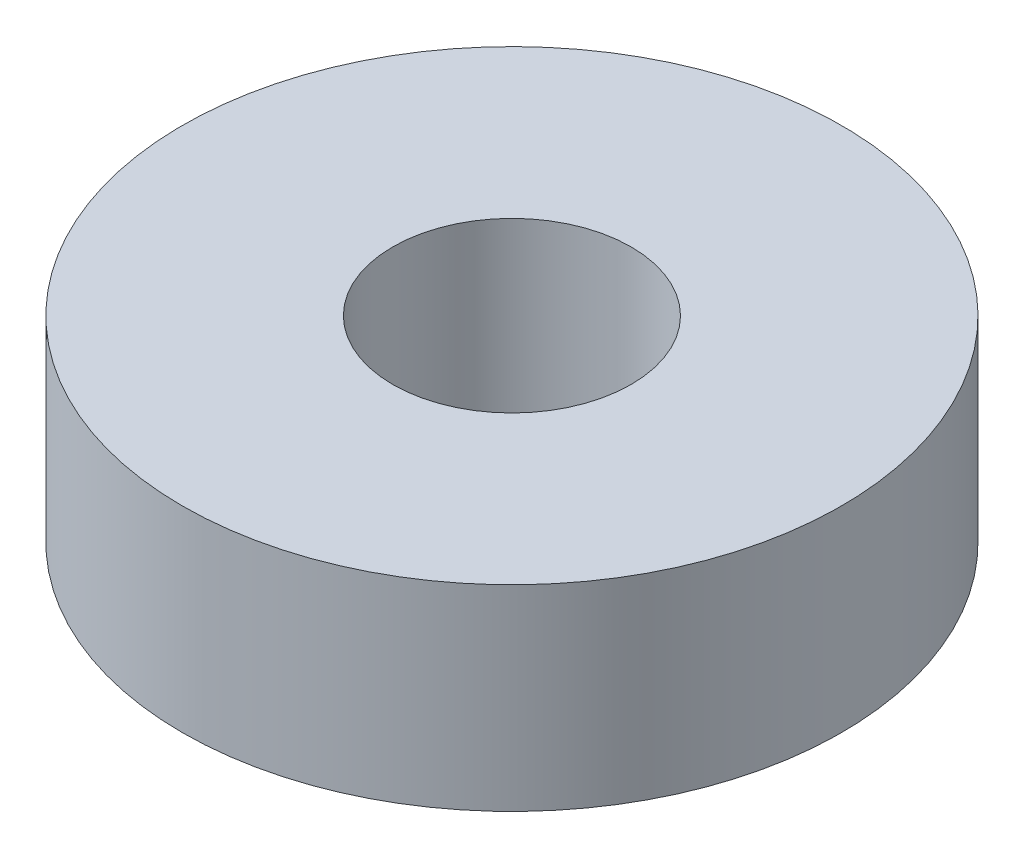
ISO-10303-21;
HEADER;
FILE_DESCRIPTION(('STEP AP214'),'2;1');
FILE_NAME('part.step','',(''),(''),'','','');
FILE_SCHEMA(('AUTOMOTIVE_DESIGN { 1 0 10303 214 1 1 1 1 }'));
ENDSEC;
DATA;
#1=APPLICATION_CONTEXT('core data for automotive mechanical design processes');
#2=APPLICATION_PROTOCOL_DEFINITION('international standard','automotive_design',2000,#1);
#3=PRODUCT_CONTEXT('',#1,'mechanical');
#4=PRODUCT('Part','Part','',(#3));
#5=PRODUCT_RELATED_PRODUCT_CATEGORY('part','',(#4));
#6=PRODUCT_DEFINITION_FORMATION('','',#4);
#7=PRODUCT_DEFINITION_CONTEXT('part definition',#1,'design');
#8=PRODUCT_DEFINITION('design','',#6,#7);
#9=PRODUCT_DEFINITION_SHAPE('','',#8);
#10=(LENGTH_UNIT() NAMED_UNIT(*) SI_UNIT(.MILLI.,.METRE.));
#11=(NAMED_UNIT(*) PLANE_ANGLE_UNIT() SI_UNIT($,.RADIAN.));
#12=(NAMED_UNIT(*) SI_UNIT($,.STERADIAN.) SOLID_ANGLE_UNIT());
#13=UNCERTAINTY_MEASURE_WITH_UNIT(LENGTH_MEASURE(1.E-05),#10,'distance_accuracy_value','');
#14=(GEOMETRIC_REPRESENTATION_CONTEXT(3) GLOBAL_UNCERTAINTY_ASSIGNED_CONTEXT((#13)) GLOBAL_UNIT_ASSIGNED_CONTEXT((#10,
#11,#12)) REPRESENTATION_CONTEXT('',''));
#15=CARTESIAN_POINT('',(0.,0.,0.));
#16=DIRECTION('',(0.,0.,1.));
#17=DIRECTION('',(1.,0.,0.));
#18=AXIS2_PLACEMENT_3D('',#15,#16,#17);
#19=CARTESIAN_POINT('',(0.,14.,0.));
#20=DIRECTION('',(0.,1.,0.));
#21=DIRECTION('',(0.,0.,1.));
#22=AXIS2_PLACEMENT_3D('',#19,#20,#21);
#23=PLANE('',#22);
#24=CARTESIAN_POINT('',(0.,14.,0.));
#25=DIRECTION('',(0.,1.,0.));
#26=DIRECTION('',(0.,0.,1.));
#27=AXIS2_PLACEMENT_3D('',#24,#25,#26);
#28=CIRCLE('',#27,23.5);
#29=CARTESIAN_POINT('',(0.,14.,23.5));
#30=VERTEX_POINT('',#29);
#31=EDGE_CURVE('E10',#30,#30,#28,.T.);
#32=ORIENTED_EDGE('',*,*,#31,.T.);
#33=EDGE_LOOP('',(#32));
#34=FACE_BOUND('',#33,.T.);
#35=CARTESIAN_POINT('',(0.,14.,0.));
#36=DIRECTION('',(0.,1.,0.));
#37=DIRECTION('',(0.,0.,1.));
#38=AXIS2_PLACEMENT_3D('',#35,#36,#37);
#39=CIRCLE('',#38,8.5);
#40=CARTESIAN_POINT('',(0.,14.,8.5));
#41=VERTEX_POINT('',#40);
#42=EDGE_CURVE('E50',#41,#41,#39,.T.);
#43=ORIENTED_EDGE('',*,*,#42,.F.);
#44=EDGE_LOOP('',(#43));
#45=FACE_BOUND('',#44,.T.);
#46=ADVANCED_FACE('F37',(#34,#45),#23,.T.);
#47=CARTESIAN_POINT('',(0.,0.,0.));
#48=DIRECTION('',(0.,1.,0.));
#49=DIRECTION('',(0.,0.,1.));
#50=AXIS2_PLACEMENT_3D('',#47,#48,#49);
#51=PLANE('',#50);
#52=CARTESIAN_POINT('',(0.,0.,0.));
#53=DIRECTION('',(0.,1.,0.));
#54=DIRECTION('',(0.,0.,1.));
#55=AXIS2_PLACEMENT_3D('',#52,#53,#54);
#56=CIRCLE('',#55,23.5);
#57=CARTESIAN_POINT('',(0.,0.,23.5));
#58=VERTEX_POINT('',#57);
#59=EDGE_CURVE('E41',#58,#58,#56,.T.);
#60=ORIENTED_EDGE('',*,*,#59,.F.);
#61=EDGE_LOOP('',(#60));
#62=FACE_BOUND('',#61,.T.);
#63=CARTESIAN_POINT('',(0.,0.,0.));
#64=DIRECTION('',(0.,1.,0.));
#65=DIRECTION('',(0.,0.,1.));
#66=AXIS2_PLACEMENT_3D('',#63,#64,#65);
#67=CIRCLE('',#66,8.5);
#68=CARTESIAN_POINT('',(0.,0.,8.5));
#69=VERTEX_POINT('',#68);
#70=EDGE_CURVE('E52',#69,#69,#67,.T.);
#71=ORIENTED_EDGE('',*,*,#70,.T.);
#72=EDGE_LOOP('',(#71));
#73=FACE_BOUND('',#72,.T.);
#74=ADVANCED_FACE('F64',(#62,#73),#51,.F.);
#75=CARTESIAN_POINT('',(0.,14.,0.));
#76=DIRECTION('',(0.,-1.,0.));
#77=DIRECTION('',(0.,0.,-1.));
#78=AXIS2_PLACEMENT_3D('',#75,#76,#77);
#79=CYLINDRICAL_SURFACE('',#78,23.5);
#80=ORIENTED_EDGE('',*,*,#31,.F.);
#81=EDGE_LOOP('',(#80));
#82=FACE_BOUND('',#81,.T.);
#83=ORIENTED_EDGE('',*,*,#59,.T.);
#84=EDGE_LOOP('',(#83));
#85=FACE_BOUND('',#84,.T.);
#86=ADVANCED_FACE('F39',(#82,#85),#79,.T.);
#87=CARTESIAN_POINT('',(0.,14.,0.));
#88=DIRECTION('',(0.,-1.,0.));
#89=DIRECTION('',(0.,0.,-1.));
#90=AXIS2_PLACEMENT_3D('',#87,#88,#89);
#91=CYLINDRICAL_SURFACE('',#90,8.5);
#92=ORIENTED_EDGE('',*,*,#42,.T.);
#93=EDGE_LOOP('',(#92));
#94=FACE_BOUND('',#93,.T.);
#95=ORIENTED_EDGE('',*,*,#70,.F.);
#96=EDGE_LOOP('',(#95));
#97=FACE_BOUND('',#96,.T.);
#98=ADVANCED_FACE('F60',(#94,#97),#91,.F.);
#99=CLOSED_SHELL('',(#46,#74,#86,#98));
#100=MANIFOLD_SOLID_BREP('B2',#99);
#101=ADVANCED_BREP_SHAPE_REPRESENTATION('',(#18,#100),#14);
#102=SHAPE_DEFINITION_REPRESENTATION(#9,#101);
ENDSEC;
END-ISO-10303-21;
